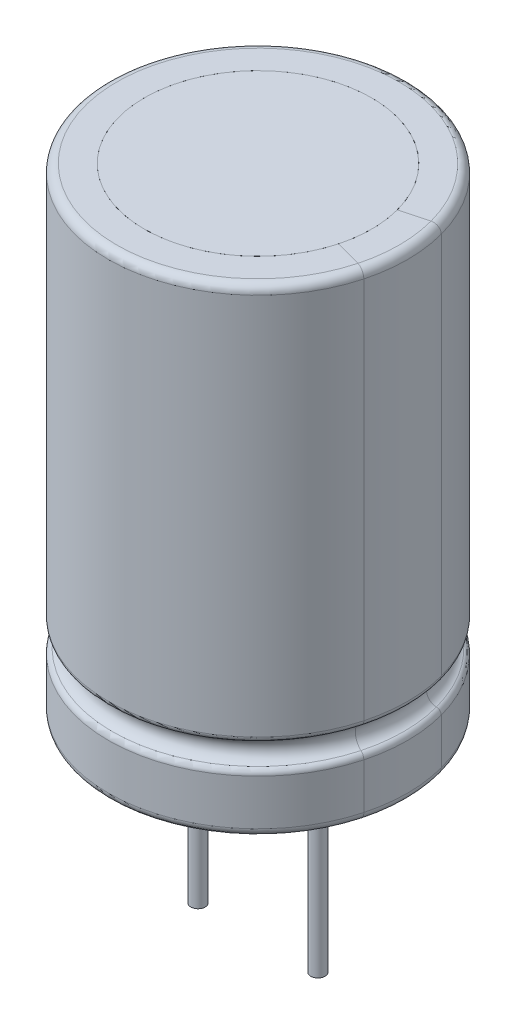
ISO-10303-21;
HEADER;
FILE_DESCRIPTION(('STEP AP214'),'2;1');
FILE_NAME('part.step','',(''),(''),'','','');
FILE_SCHEMA(('AUTOMOTIVE_DESIGN { 1 0 10303 214 1 1 1 1 }'));
ENDSEC;
DATA;
#1=APPLICATION_CONTEXT('core data for automotive mechanical design processes');
#2=APPLICATION_PROTOCOL_DEFINITION('international standard','automotive_design',2000,#1);
#3=PRODUCT_CONTEXT('',#1,'mechanical');
#4=PRODUCT('Part','Part','',(#3));
#5=PRODUCT_RELATED_PRODUCT_CATEGORY('part','',(#4));
#6=PRODUCT_DEFINITION_FORMATION('','',#4);
#7=PRODUCT_DEFINITION_CONTEXT('part definition',#1,'design');
#8=PRODUCT_DEFINITION('design','',#6,#7);
#9=PRODUCT_DEFINITION_SHAPE('','',#8);
#10=(LENGTH_UNIT() NAMED_UNIT(*) SI_UNIT(.MILLI.,.METRE.));
#11=(NAMED_UNIT(*) PLANE_ANGLE_UNIT() SI_UNIT($,.RADIAN.));
#12=(NAMED_UNIT(*) SI_UNIT($,.STERADIAN.) SOLID_ANGLE_UNIT());
#13=UNCERTAINTY_MEASURE_WITH_UNIT(LENGTH_MEASURE(1.E-05),#10,'distance_accuracy_value','');
#14=(GEOMETRIC_REPRESENTATION_CONTEXT(3) GLOBAL_UNCERTAINTY_ASSIGNED_CONTEXT((#13)) GLOBAL_UNIT_ASSIGNED_CONTEXT((#10,
#11,#12)) REPRESENTATION_CONTEXT('',''));
#15=CARTESIAN_POINT('',(0.,0.,0.));
#16=DIRECTION('',(0.,0.,1.));
#17=DIRECTION('',(1.,0.,0.));
#18=AXIS2_PLACEMENT_3D('',#15,#16,#17);
#19=CARTESIAN_POINT('',(2.50410434400621,-8.,0.));
#20=DIRECTION('',(0.,1.,0.));
#21=DIRECTION('',(0.,0.,1.));
#22=AXIS2_PLACEMENT_3D('',#19,#20,#21);
#23=CYLINDRICAL_SURFACE('',#22,0.3);
#24=CARTESIAN_POINT('',(2.50410434400621,-8.,0.));
#25=DIRECTION('',(0.,1.,0.));
#26=DIRECTION('',(0.,0.,1.));
#27=AXIS2_PLACEMENT_3D('',#24,#25,#26);
#28=CIRCLE('',#27,0.3);
#29=CARTESIAN_POINT('',(2.50410434400621,-8.,0.3));
#30=VERTEX_POINT('',#29);
#31=EDGE_CURVE('E11',#30,#30,#28,.T.);
#32=ORIENTED_EDGE('',*,*,#31,.T.);
#33=EDGE_LOOP('',(#32));
#34=FACE_BOUND('',#33,.T.);
#35=CARTESIAN_POINT('',(2.50410434400621,0.,0.));
#36=DIRECTION('',(0.,1.,0.));
#37=DIRECTION('',(0.,0.,1.));
#38=AXIS2_PLACEMENT_3D('',#35,#36,#37);
#39=CIRCLE('',#38,0.3);
#40=CARTESIAN_POINT('',(2.50410434400621,0.,0.3));
#41=VERTEX_POINT('',#40);
#42=EDGE_CURVE('E49',#41,#41,#39,.T.);
#43=ORIENTED_EDGE('',*,*,#42,.F.);
#44=EDGE_LOOP('',(#43));
#45=FACE_BOUND('',#44,.T.);
#46=ADVANCED_FACE('F46',(#34,#45),#23,.T.);
#47=CARTESIAN_POINT('',(2.50410434400621,-8.,0.));
#48=DIRECTION('',(0.,1.,0.));
#49=DIRECTION('',(0.,0.,1.));
#50=AXIS2_PLACEMENT_3D('',#47,#48,#49);
#51=PLANE('',#50);
#52=ORIENTED_EDGE('',*,*,#31,.F.);
#53=EDGE_LOOP('',(#52));
#54=FACE_BOUND('',#53,.T.);
#55=ADVANCED_FACE('F61',(#54),#51,.F.);
#56=CARTESIAN_POINT('',(2.50410434400621,0.,0.));
#57=DIRECTION('',(0.,1.,0.));
#58=DIRECTION('',(0.,0.,1.));
#59=AXIS2_PLACEMENT_3D('',#56,#57,#58);
#60=PLANE('',#59);
#61=ORIENTED_EDGE('',*,*,#42,.T.);
#62=EDGE_LOOP('',(#61));
#63=FACE_BOUND('',#62,.T.);
#64=ADVANCED_FACE('F58',(#63),#60,.T.);
#65=CLOSED_SHELL('',(#46,#55,#64));
#66=MANIFOLD_SOLID_BREP('B2',#65);
#67=CARTESIAN_POINT('',(-2.50410434400621,-8.,0.));
#68=DIRECTION('',(0.,1.,0.));
#69=DIRECTION('',(0.,0.,1.));
#70=AXIS2_PLACEMENT_3D('',#67,#68,#69);
#71=CYLINDRICAL_SURFACE('',#70,0.3);
#72=CARTESIAN_POINT('',(-2.50410434400621,-8.,0.));
#73=DIRECTION('',(0.,1.,0.));
#74=DIRECTION('',(0.,0.,1.));
#75=AXIS2_PLACEMENT_3D('',#72,#73,#74);
#76=CIRCLE('',#75,0.3);
#77=CARTESIAN_POINT('',(-2.50410434400621,-8.,0.3));
#78=VERTEX_POINT('',#77);
#79=EDGE_CURVE('E45',#78,#78,#76,.T.);
#80=ORIENTED_EDGE('',*,*,#79,.T.);
#81=EDGE_LOOP('',(#80));
#82=FACE_BOUND('',#81,.T.);
#83=CARTESIAN_POINT('',(-2.50410434400621,0.,0.));
#84=DIRECTION('',(0.,1.,0.));
#85=DIRECTION('',(0.,0.,1.));
#86=AXIS2_PLACEMENT_3D('',#83,#84,#85);
#87=CIRCLE('',#86,0.3);
#88=CARTESIAN_POINT('',(-2.50410434400621,0.,0.3));
#89=VERTEX_POINT('',#88);
#90=EDGE_CURVE('E100',#89,#89,#87,.T.);
#91=ORIENTED_EDGE('',*,*,#90,.F.);
#92=EDGE_LOOP('',(#91));
#93=FACE_BOUND('',#92,.T.);
#94=ADVANCED_FACE('F97',(#82,#93),#71,.T.);
#95=CARTESIAN_POINT('',(-2.50410434400621,-8.,0.));
#96=DIRECTION('',(0.,1.,0.));
#97=DIRECTION('',(0.,0.,1.));
#98=AXIS2_PLACEMENT_3D('',#95,#96,#97);
#99=PLANE('',#98);
#100=ORIENTED_EDGE('',*,*,#79,.F.);
#101=EDGE_LOOP('',(#100));
#102=FACE_BOUND('',#101,.T.);
#103=ADVANCED_FACE('F112',(#102),#99,.F.);
#104=CARTESIAN_POINT('',(-2.50410434400621,0.,0.));
#105=DIRECTION('',(0.,1.,0.));
#106=DIRECTION('',(0.,0.,1.));
#107=AXIS2_PLACEMENT_3D('',#104,#105,#106);
#108=PLANE('',#107);
#109=ORIENTED_EDGE('',*,*,#90,.T.);
#110=EDGE_LOOP('',(#109));
#111=FACE_BOUND('',#110,.T.);
#112=ADVANCED_FACE('F109',(#111),#108,.T.);
#113=CLOSED_SHELL('',(#94,#103,#112));
#114=MANIFOLD_SOLID_BREP('B6',#113);
#115=CARTESIAN_POINT('',(0.,20.,0.));
#116=DIRECTION('',(0.,-1.,0.));
#117=DIRECTION('',(0.,0.,-1.));
#118=AXIS2_PLACEMENT_3D('',#115,#116,#117);
#119=CYLINDRICAL_SURFACE('',#118,6.25);
#120=DIRECTION('',(0.,-1.,0.));
#121=VECTOR('',#120,1.);
#122=CARTESIAN_POINT('',(6.03703641430667,20.,-1.61761903189076));
#123=LINE('',#122,#121);
#124=CARTESIAN_POINT('',(6.03703641430667,2.25336517337282,-1.61761903189076));
#125=VERTEX_POINT('',#124);
#126=CARTESIAN_POINT('',(6.03703641430667,0.35,-1.61761903189076));
#127=VERTEX_POINT('',#126);
#128=EDGE_CURVE('E264',#125,#127,#123,.T.);
#129=ORIENTED_EDGE('',*,*,#128,.F.);
#130=CARTESIAN_POINT('',(0.,2.25336517337282,0.));
#131=DIRECTION('',(0.,-1.,0.));
#132=DIRECTION('',(0.,0.,-1.));
#133=AXIS2_PLACEMENT_3D('',#130,#131,#132);
#134=CIRCLE('',#133,6.25);
#135=CARTESIAN_POINT('',(6.03703641430668,2.25336517337282,1.61761903189076));
#136=VERTEX_POINT('',#135);
#137=EDGE_CURVE('E171',#125,#136,#134,.T.);
#138=ORIENTED_EDGE('',*,*,#137,.T.);
#139=DIRECTION('',(0.,-1.,0.));
#140=VECTOR('',#139,1.);
#141=CARTESIAN_POINT('',(6.03703641430668,20.,1.61761903189076));
#142=LINE('',#141,#140);
#143=CARTESIAN_POINT('',(6.03703641430668,0.35,1.61761903189076));
#144=VERTEX_POINT('',#143);
#145=EDGE_CURVE('E268',#136,#144,#142,.T.);
#146=ORIENTED_EDGE('',*,*,#145,.T.);
#147=CARTESIAN_POINT('',(0.,0.35,0.));
#148=DIRECTION('',(0.,1.,0.));
#149=DIRECTION('',(0.,0.,1.));
#150=AXIS2_PLACEMENT_3D('',#147,#148,#149);
#151=CIRCLE('',#150,6.25);
#152=EDGE_CURVE('E271',#144,#127,#151,.T.);
#153=ORIENTED_EDGE('',*,*,#152,.T.);
#154=EDGE_LOOP('',(#129,#138,#146,#153));
#155=FACE_BOUND('',#154,.T.);
#156=ADVANCED_FACE('F148',(#155),#119,.T.);
#157=CARTESIAN_POINT('',(6.03703641430668,19.65,1.61761903189076));
#158=VERTEX_POINT('',#157);
#159=CARTESIAN_POINT('',(6.03703641430668,3.66757873574592,1.61761903189076));
#160=VERTEX_POINT('',#159);
#161=EDGE_CURVE('E237',#158,#160,#142,.T.);
#162=ORIENTED_EDGE('',*,*,#161,.T.);
#163=CARTESIAN_POINT('',(0.,3.66757873574592,0.));
#164=DIRECTION('',(0.,1.,0.));
#165=DIRECTION('',(0.,0.,1.));
#166=AXIS2_PLACEMENT_3D('',#163,#164,#165);
#167=CIRCLE('',#166,6.25);
#168=CARTESIAN_POINT('',(6.03703641430667,3.66757873574592,-1.61761903189076));
#169=VERTEX_POINT('',#168);
#170=EDGE_CURVE('E95',#160,#169,#167,.T.);
#171=ORIENTED_EDGE('',*,*,#170,.T.);
#172=CARTESIAN_POINT('',(6.03703641430667,19.65,-1.61761903189076));
#173=VERTEX_POINT('',#172);
#174=EDGE_CURVE('E265',#173,#169,#123,.T.);
#175=ORIENTED_EDGE('',*,*,#174,.F.);
#176=CARTESIAN_POINT('',(0.,19.65,0.));
#177=DIRECTION('',(0.,1.,0.));
#178=DIRECTION('',(0.,0.,1.));
#179=AXIS2_PLACEMENT_3D('',#176,#177,#178);
#180=CIRCLE('',#179,6.25);
#181=EDGE_CURVE('E236',#173,#158,#180,.F.);
#182=ORIENTED_EDGE('',*,*,#181,.T.);
#183=EDGE_LOOP('',(#162,#171,#175,#182));
#184=FACE_BOUND('',#183,.T.);
#185=ADVANCED_FACE('F331',(#184),#119,.T.);
#186=CARTESIAN_POINT('',(0.,20.,0.));
#187=DIRECTION('',(0.,-1.,0.));
#188=DIRECTION('',(0.,0.,-1.));
#189=AXIS2_PLACEMENT_3D('',#186,#187,#188);
#190=CYLINDRICAL_SURFACE('',#189,4.75);
#191=CARTESIAN_POINT('',(0.,0.,0.));
#192=DIRECTION('',(0.,1.,0.));
#193=DIRECTION('',(0.,0.,1.));
#194=AXIS2_PLACEMENT_3D('',#191,#192,#193);
#195=CIRCLE('',#194,4.75);
#196=CARTESIAN_POINT('',(4.58814767487307,0.,1.22939046423698));
#197=VERTEX_POINT('',#196);
#198=CARTESIAN_POINT('',(4.58814767487307,0.,-1.22939046423698));
#199=VERTEX_POINT('',#198);
#200=EDGE_CURVE('E233',#197,#199,#195,.T.);
#201=ORIENTED_EDGE('',*,*,#200,.F.);
#202=DIRECTION('',(0.,-1.,0.));
#203=VECTOR('',#202,1.);
#204=CARTESIAN_POINT('',(4.58814767487307,20.,1.22939046423698));
#205=LINE('',#204,#203);
#206=CARTESIAN_POINT('',(4.58814767487307,20.,1.22939046423698));
#207=VERTEX_POINT('',#206);
#208=EDGE_CURVE('E226',#207,#197,#205,.T.);
#209=ORIENTED_EDGE('',*,*,#208,.F.);
#210=CARTESIAN_POINT('',(0.,20.,0.));
#211=DIRECTION('',(0.,1.,0.));
#212=DIRECTION('',(0.,0.,1.));
#213=AXIS2_PLACEMENT_3D('',#210,#211,#212);
#214=CIRCLE('',#213,4.75);
#215=CARTESIAN_POINT('',(4.58814767487307,20.,-1.22939046423698));
#216=VERTEX_POINT('',#215);
#217=EDGE_CURVE('E230',#207,#216,#214,.T.);
#218=ORIENTED_EDGE('',*,*,#217,.T.);
#219=DIRECTION('',(0.,-1.,0.));
#220=VECTOR('',#219,1.);
#221=CARTESIAN_POINT('',(4.58814767487307,20.,-1.22939046423698));
#222=LINE('',#221,#220);
#223=EDGE_CURVE('E260',#216,#199,#222,.T.);
#224=ORIENTED_EDGE('',*,*,#223,.T.);
#225=EDGE_LOOP('',(#201,#209,#218,#224));
#226=FACE_BOUND('',#225,.T.);
#227=ADVANCED_FACE('F228',(#226),#190,.F.);
#228=CARTESIAN_POINT('',(0.,20.,0.));
#229=DIRECTION('',(0.258819045102521,0.,-0.965925826289068));
#230=DIRECTION('',(-0.965925826289068,0.,-0.258819045102521));
#231=AXIS2_PLACEMENT_3D('',#228,#229,#230);
#232=PLANE('',#231);
#233=ORIENTED_EDGE('',*,*,#145,.F.);
#234=CARTESIAN_POINT('',(5.79555495773441,2.25336517337282,1.55291427061513));
#235=DIRECTION('',(0.258819045102521,0.,-0.965925826289068));
#236=DIRECTION('',(-0.965925826289068,0.,-0.258819045102521));
#237=AXIS2_PLACEMENT_3D('',#234,#235,#236);
#238=CIRCLE('',#237,0.25);
#239=CARTESIAN_POINT('',(5.87604877659183,2.48906743376834,1.57448252437367));
#240=VERTEX_POINT('',#239);
#241=EDGE_CURVE('E156',#136,#240,#238,.F.);
#242=ORIENTED_EDGE('',*,*,#241,.T.);
#243=CARTESIAN_POINT('',(6.03703641430668,2.96047195455937,1.61761903189076));
#244=DIRECTION('',(0.258819045102521,0.,-0.965925826289068));
#245=DIRECTION('',(-0.965925826289068,0.,-0.258819045102521));
#246=AXIS2_PLACEMENT_3D('',#243,#244,#245);
#247=CIRCLE('',#246,0.500000000000001);
#248=CARTESIAN_POINT('',(5.87604877659183,3.4318764753504,1.57448252437367));
#249=VERTEX_POINT('',#248);
#250=EDGE_CURVE('E257',#249,#240,#247,.F.);
#251=ORIENTED_EDGE('',*,*,#250,.F.);
#252=CARTESIAN_POINT('',(5.79555495773441,3.66757873574592,1.55291427061513));
#253=DIRECTION('',(0.258819045102521,0.,-0.965925826289068));
#254=DIRECTION('',(-0.965925826289068,0.,-0.258819045102521));
#255=AXIS2_PLACEMENT_3D('',#252,#253,#254);
#256=CIRCLE('',#255,0.25);
#257=EDGE_CURVE('E163',#249,#160,#256,.F.);
#258=ORIENTED_EDGE('',*,*,#257,.T.);
#259=ORIENTED_EDGE('',*,*,#161,.F.);
#260=CARTESIAN_POINT('',(5.6989623751055,19.65,1.52703236610488));
#261=DIRECTION('',(0.258819045102521,0.,-0.965925826289068));
#262=DIRECTION('',(-0.965925826289068,0.,-0.258819045102521));
#263=AXIS2_PLACEMENT_3D('',#260,#261,#262);
#264=CIRCLE('',#263,0.35);
#265=CARTESIAN_POINT('',(5.6989623751055,20.,1.52703236610488));
#266=VERTEX_POINT('',#265);
#267=EDGE_CURVE('E243',#158,#266,#264,.F.);
#268=ORIENTED_EDGE('',*,*,#267,.T.);
#269=DIRECTION('',(0.965925826289068,0.,0.258819045102521));
#270=VECTOR('',#269,1.);
#271=CARTESIAN_POINT('',(0.,20.,0.));
#272=LINE('',#271,#270);
#273=EDGE_CURVE('E240',#207,#266,#272,.T.);
#274=ORIENTED_EDGE('',*,*,#273,.F.);
#275=ORIENTED_EDGE('',*,*,#208,.T.);
#276=DIRECTION('',(0.965925826289068,0.,0.258819045102521));
#277=VECTOR('',#276,1.);
#278=CARTESIAN_POINT('',(0.,0.,0.));
#279=LINE('',#278,#277);
#280=CARTESIAN_POINT('',(5.6989623751055,0.,1.52703236610488));
#281=VERTEX_POINT('',#280);
#282=EDGE_CURVE('E254',#197,#281,#279,.T.);
#283=ORIENTED_EDGE('',*,*,#282,.T.);
#284=CARTESIAN_POINT('',(5.6989623751055,0.35,1.52703236610488));
#285=DIRECTION('',(0.258819045102521,0.,-0.965925826289068));
#286=DIRECTION('',(-0.965925826289068,0.,-0.258819045102521));
#287=AXIS2_PLACEMENT_3D('',#284,#285,#286);
#288=CIRCLE('',#287,0.35);
#289=EDGE_CURVE('E281',#281,#144,#288,.F.);
#290=ORIENTED_EDGE('',*,*,#289,.T.);
#291=EDGE_LOOP('',(#233,#242,#251,#258,#259,#268,#274,#275,#283,#290));
#292=FACE_BOUND('',#291,.T.);
#293=ADVANCED_FACE('F241',(#292),#232,.F.);
#294=CARTESIAN_POINT('',(0.,20.,0.));
#295=DIRECTION('',(-0.258819045102522,0.,-0.965925826289068));
#296=DIRECTION('',(-0.965925826289068,0.,0.258819045102522));
#297=AXIS2_PLACEMENT_3D('',#294,#295,#296);
#298=PLANE('',#297);
#299=CARTESIAN_POINT('',(6.03703641430668,2.96047195455937,-1.61761903189076));
#300=DIRECTION('',(-0.258819045102522,0.,-0.965925826289068));
#301=DIRECTION('',(-0.965925826289068,0.,0.258819045102522));
#302=AXIS2_PLACEMENT_3D('',#299,#300,#301);
#303=CIRCLE('',#302,0.500000000000001);
#304=CARTESIAN_POINT('',(5.87604877659183,3.4318764753504,-1.57448252437367));
#305=VERTEX_POINT('',#304);
#306=CARTESIAN_POINT('',(5.87604877659183,2.48906743376834,-1.57448252437367));
#307=VERTEX_POINT('',#306);
#308=EDGE_CURVE('E286',#305,#307,#303,.F.);
#309=ORIENTED_EDGE('',*,*,#308,.T.);
#310=CARTESIAN_POINT('',(5.79555495773441,2.25336517337282,-1.55291427061513));
#311=DIRECTION('',(-0.258819045102522,0.,-0.965925826289068));
#312=DIRECTION('',(-0.965925826289068,0.,0.258819045102522));
#313=AXIS2_PLACEMENT_3D('',#310,#311,#312);
#314=CIRCLE('',#313,0.25);
#315=EDGE_CURVE('E297',#307,#125,#314,.T.);
#316=ORIENTED_EDGE('',*,*,#315,.T.);
#317=ORIENTED_EDGE('',*,*,#128,.T.);
#318=CARTESIAN_POINT('',(5.6989623751055,0.35,-1.52703236610488));
#319=DIRECTION('',(-0.258819045102522,0.,-0.965925826289068));
#320=DIRECTION('',(-0.965925826289068,0.,0.258819045102522));
#321=AXIS2_PLACEMENT_3D('',#318,#319,#320);
#322=CIRCLE('',#321,0.35);
#323=CARTESIAN_POINT('',(5.6989623751055,0.,-1.52703236610488));
#324=VERTEX_POINT('',#323);
#325=EDGE_CURVE('E276',#127,#324,#322,.T.);
#326=ORIENTED_EDGE('',*,*,#325,.T.);
#327=DIRECTION('',(0.965925826289068,0.,-0.258819045102522));
#328=VECTOR('',#327,1.);
#329=CARTESIAN_POINT('',(0.,0.,0.));
#330=LINE('',#329,#328);
#331=EDGE_CURVE('E251',#199,#324,#330,.T.);
#332=ORIENTED_EDGE('',*,*,#331,.F.);
#333=ORIENTED_EDGE('',*,*,#223,.F.);
#334=DIRECTION('',(0.965925826289068,0.,-0.258819045102522));
#335=VECTOR('',#334,1.);
#336=CARTESIAN_POINT('',(0.,20.,0.));
#337=LINE('',#336,#335);
#338=CARTESIAN_POINT('',(5.6989623751055,20.,-1.52703236610488));
#339=VERTEX_POINT('',#338);
#340=EDGE_CURVE('E247',#216,#339,#337,.T.);
#341=ORIENTED_EDGE('',*,*,#340,.T.);
#342=CARTESIAN_POINT('',(5.6989623751055,19.65,-1.52703236610488));
#343=DIRECTION('',(-0.258819045102522,0.,-0.965925826289068));
#344=DIRECTION('',(-0.965925826289068,0.,0.258819045102522));
#345=AXIS2_PLACEMENT_3D('',#342,#343,#344);
#346=CIRCLE('',#345,0.35);
#347=EDGE_CURVE('E274',#339,#173,#346,.T.);
#348=ORIENTED_EDGE('',*,*,#347,.T.);
#349=ORIENTED_EDGE('',*,*,#174,.T.);
#350=CARTESIAN_POINT('',(5.79555495773441,3.66757873574592,-1.55291427061513));
#351=DIRECTION('',(-0.258819045102522,0.,-0.965925826289068));
#352=DIRECTION('',(-0.965925826289068,0.,0.258819045102522));
#353=AXIS2_PLACEMENT_3D('',#350,#351,#352);
#354=CIRCLE('',#353,0.25);
#355=EDGE_CURVE('E295',#169,#305,#354,.T.);
#356=ORIENTED_EDGE('',*,*,#355,.T.);
#357=EDGE_LOOP('',(#309,#316,#317,#326,#332,#333,#341,#348,#349,#356));
#358=FACE_BOUND('',#357,.T.);
#359=ADVANCED_FACE('F310',(#358),#298,.T.);
#360=CARTESIAN_POINT('',(0.,20.,0.));
#361=DIRECTION('',(0.,1.,0.));
#362=DIRECTION('',(0.,0.,1.));
#363=AXIS2_PLACEMENT_3D('',#360,#361,#362);
#364=PLANE('',#363);
#365=ORIENTED_EDGE('',*,*,#273,.T.);
#366=CARTESIAN_POINT('',(0.,20.,0.));
#367=DIRECTION('',(0.,1.,0.));
#368=DIRECTION('',(0.,0.,1.));
#369=AXIS2_PLACEMENT_3D('',#366,#367,#368);
#370=CIRCLE('',#369,5.9);
#371=EDGE_CURVE('E284',#266,#339,#370,.T.);
#372=ORIENTED_EDGE('',*,*,#371,.T.);
#373=ORIENTED_EDGE('',*,*,#340,.F.);
#374=ORIENTED_EDGE('',*,*,#217,.F.);
#375=EDGE_LOOP('',(#365,#372,#373,#374));
#376=FACE_BOUND('',#375,.T.);
#377=ADVANCED_FACE('F249',(#376),#364,.T.);
#378=CARTESIAN_POINT('',(0.,0.,0.));
#379=DIRECTION('',(0.,1.,0.));
#380=DIRECTION('',(0.,0.,1.));
#381=AXIS2_PLACEMENT_3D('',#378,#379,#380);
#382=PLANE('',#381);
#383=ORIENTED_EDGE('',*,*,#331,.T.);
#384=CARTESIAN_POINT('',(0.,0.,0.));
#385=DIRECTION('',(0.,1.,0.));
#386=DIRECTION('',(0.,0.,1.));
#387=AXIS2_PLACEMENT_3D('',#384,#385,#386);
#388=CIRCLE('',#387,5.9);
#389=EDGE_CURVE('E278',#324,#281,#388,.F.);
#390=ORIENTED_EDGE('',*,*,#389,.T.);
#391=ORIENTED_EDGE('',*,*,#282,.F.);
#392=ORIENTED_EDGE('',*,*,#200,.T.);
#393=EDGE_LOOP('',(#383,#390,#391,#392));
#394=FACE_BOUND('',#393,.T.);
#395=ADVANCED_FACE('F319',(#394),#382,.F.);
#396=CARTESIAN_POINT('',(0.,0.35,0.));
#397=DIRECTION('',(0.,1.,0.));
#398=DIRECTION('',(0.,0.,1.));
#399=AXIS2_PLACEMENT_3D('',#396,#397,#398);
#400=TOROIDAL_SURFACE('',#399,5.9,0.35);
#401=ORIENTED_EDGE('',*,*,#289,.F.);
#402=ORIENTED_EDGE('',*,*,#389,.F.);
#403=ORIENTED_EDGE('',*,*,#325,.F.);
#404=ORIENTED_EDGE('',*,*,#152,.F.);
#405=EDGE_LOOP('',(#401,#402,#403,#404));
#406=FACE_BOUND('',#405,.T.);
#407=ADVANCED_FACE('F315',(#406),#400,.T.);
#408=CARTESIAN_POINT('',(0.,19.65,0.));
#409=DIRECTION('',(0.,1.,0.));
#410=DIRECTION('',(0.,0.,1.));
#411=AXIS2_PLACEMENT_3D('',#408,#409,#410);
#412=TOROIDAL_SURFACE('',#411,5.9,0.35);
#413=ORIENTED_EDGE('',*,*,#267,.F.);
#414=ORIENTED_EDGE('',*,*,#181,.F.);
#415=ORIENTED_EDGE('',*,*,#347,.F.);
#416=ORIENTED_EDGE('',*,*,#371,.F.);
#417=EDGE_LOOP('',(#413,#414,#415,#416));
#418=FACE_BOUND('',#417,.T.);
#419=ADVANCED_FACE('F326',(#418),#412,.T.);
#420=CARTESIAN_POINT('',(0.,2.96047195455937,0.));
#421=DIRECTION('',(0.,-1.,0.));
#422=DIRECTION('',(0.,0.,-1.));
#423=AXIS2_PLACEMENT_3D('',#420,#421,#422);
#424=TOROIDAL_SURFACE('',#423,6.25,0.500000000000001);
#425=ORIENTED_EDGE('',*,*,#250,.T.);
#426=CARTESIAN_POINT('',(0.,2.48906743376847,0.));
#427=DIRECTION('',(0.,1.,0.));
#428=DIRECTION('',(0.,0.,1.));
#429=AXIS2_PLACEMENT_3D('',#426,#427,#428);
#430=CIRCLE('',#429,6.08333333333338);
#431=EDGE_CURVE('E292',#240,#307,#430,.T.);
#432=ORIENTED_EDGE('',*,*,#431,.T.);
#433=ORIENTED_EDGE('',*,*,#308,.F.);
#434=CARTESIAN_POINT('',(0.,3.43187647535033,0.));
#435=DIRECTION('',(0.,-1.,0.));
#436=DIRECTION('',(0.,0.,-1.));
#437=AXIS2_PLACEMENT_3D('',#434,#435,#436);
#438=CIRCLE('',#437,6.08333333333336);
#439=EDGE_CURVE('E289',#305,#249,#438,.T.);
#440=ORIENTED_EDGE('',*,*,#439,.T.);
#441=EDGE_LOOP('',(#425,#432,#433,#440));
#442=FACE_BOUND('',#441,.T.);
#443=ADVANCED_FACE('F305',(#442),#424,.F.);
#444=CARTESIAN_POINT('',(0.,2.25336517337282,0.));
#445=DIRECTION('',(0.,-1.,0.));
#446=DIRECTION('',(0.,0.,-1.));
#447=AXIS2_PLACEMENT_3D('',#444,#445,#446);
#448=TOROIDAL_SURFACE('',#447,6.,0.25);
#449=ORIENTED_EDGE('',*,*,#241,.F.);
#450=ORIENTED_EDGE('',*,*,#137,.F.);
#451=ORIENTED_EDGE('',*,*,#315,.F.);
#452=ORIENTED_EDGE('',*,*,#431,.F.);
#453=EDGE_LOOP('',(#449,#450,#451,#452));
#454=FACE_BOUND('',#453,.T.);
#455=ADVANCED_FACE('F308',(#454),#448,.T.);
#456=CARTESIAN_POINT('',(0.,3.66757873574592,0.));
#457=DIRECTION('',(0.,1.,0.));
#458=DIRECTION('',(0.,0.,1.));
#459=AXIS2_PLACEMENT_3D('',#456,#457,#458);
#460=TOROIDAL_SURFACE('',#459,6.,0.25);
#461=ORIENTED_EDGE('',*,*,#355,.F.);
#462=ORIENTED_EDGE('',*,*,#170,.F.);
#463=ORIENTED_EDGE('',*,*,#257,.F.);
#464=ORIENTED_EDGE('',*,*,#439,.F.);
#465=EDGE_LOOP('',(#461,#462,#463,#464));
#466=FACE_BOUND('',#465,.T.);
#467=ADVANCED_FACE('F150',(#466),#460,.T.);
#468=CLOSED_SHELL('',(#156,#185,#227,#293,#359,#377,#395,#407,#419,#443,#455,#467));
#469=MANIFOLD_SOLID_BREP('B40',#468);
#470=CARTESIAN_POINT('',(0.,20.,0.));
#471=DIRECTION('',(0.,-1.,0.));
#472=DIRECTION('',(0.,0.,-1.));
#473=AXIS2_PLACEMENT_3D('',#470,#471,#472);
#474=CYLINDRICAL_SURFACE('',#473,6.25);
#475=DIRECTION('',(0.,-1.,0.));
#476=VECTOR('',#475,1.);
#477=CARTESIAN_POINT('',(6.03703641430668,20.,1.61761903189076));
#478=LINE('',#477,#476);
#479=CARTESIAN_POINT('',(6.03703641430668,2.25336517337282,1.61761903189076));
#480=VERTEX_POINT('',#479);
#481=CARTESIAN_POINT('',(6.03703641430668,0.35,1.61761903189076));
#482=VERTEX_POINT('',#481);
#483=EDGE_CURVE('E548',#480,#482,#478,.T.);
#484=ORIENTED_EDGE('',*,*,#483,.F.);
#485=CARTESIAN_POINT('',(0.,2.25336517337282,0.));
#486=DIRECTION('',(0.,-1.,0.));
#487=DIRECTION('',(0.,0.,-1.));
#488=AXIS2_PLACEMENT_3D('',#485,#486,#487);
#489=CIRCLE('',#488,6.25);
#490=CARTESIAN_POINT('',(6.03703641430667,2.25336517337282,-1.61761903189076));
#491=VERTEX_POINT('',#490);
#492=EDGE_CURVE('E455',#480,#491,#489,.T.);
#493=ORIENTED_EDGE('',*,*,#492,.T.);
#494=DIRECTION('',(0.,-1.,0.));
#495=VECTOR('',#494,1.);
#496=CARTESIAN_POINT('',(6.03703641430667,20.,-1.61761903189076));
#497=LINE('',#496,#495);
#498=CARTESIAN_POINT('',(6.03703641430667,0.35,-1.61761903189076));
#499=VERTEX_POINT('',#498);
#500=EDGE_CURVE('E552',#491,#499,#497,.T.);
#501=ORIENTED_EDGE('',*,*,#500,.T.);
#502=CARTESIAN_POINT('',(0.,0.35,0.));
#503=DIRECTION('',(0.,1.,0.));
#504=DIRECTION('',(0.,0.,1.));
#505=AXIS2_PLACEMENT_3D('',#502,#503,#504);
#506=CIRCLE('',#505,6.25);
#507=EDGE_CURVE('E560',#499,#482,#506,.T.);
#508=ORIENTED_EDGE('',*,*,#507,.T.);
#509=EDGE_LOOP('',(#484,#493,#501,#508));
#510=FACE_BOUND('',#509,.T.);
#511=ADVANCED_FACE('F432',(#510),#474,.T.);
#512=CARTESIAN_POINT('',(6.03703641430667,19.65,-1.61761903189076));
#513=VERTEX_POINT('',#512);
#514=CARTESIAN_POINT('',(6.03703641430667,3.66757873574592,-1.61761903189076));
#515=VERTEX_POINT('',#514);
#516=EDGE_CURVE('E521',#513,#515,#497,.T.);
#517=ORIENTED_EDGE('',*,*,#516,.T.);
#518=CARTESIAN_POINT('',(0.,3.66757873574592,0.));
#519=DIRECTION('',(0.,1.,0.));
#520=DIRECTION('',(0.,0.,1.));
#521=AXIS2_PLACEMENT_3D('',#518,#519,#520);
#522=CIRCLE('',#521,6.25);
#523=CARTESIAN_POINT('',(6.03703641430668,3.66757873574592,1.61761903189076));
#524=VERTEX_POINT('',#523);
#525=EDGE_CURVE('E146',#515,#524,#522,.T.);
#526=ORIENTED_EDGE('',*,*,#525,.T.);
#527=CARTESIAN_POINT('',(6.03703641430668,19.65,1.61761903189076));
#528=VERTEX_POINT('',#527);
#529=EDGE_CURVE('E549',#528,#524,#478,.T.);
#530=ORIENTED_EDGE('',*,*,#529,.F.);
#531=CARTESIAN_POINT('',(0.,19.65,0.));
#532=DIRECTION('',(0.,1.,0.));
#533=DIRECTION('',(0.,0.,1.));
#534=AXIS2_PLACEMENT_3D('',#531,#532,#533);
#535=CIRCLE('',#534,6.25);
#536=EDGE_CURVE('E557',#528,#513,#535,.F.);
#537=ORIENTED_EDGE('',*,*,#536,.T.);
#538=EDGE_LOOP('',(#517,#526,#530,#537));
#539=FACE_BOUND('',#538,.T.);
#540=ADVANCED_FACE('F616',(#539),#474,.T.);
#541=CARTESIAN_POINT('',(0.,20.,0.));
#542=DIRECTION('',(0.,-1.,0.));
#543=DIRECTION('',(0.,0.,-1.));
#544=AXIS2_PLACEMENT_3D('',#541,#542,#543);
#545=CYLINDRICAL_SURFACE('',#544,4.75);
#546=CARTESIAN_POINT('',(0.,0.,0.));
#547=DIRECTION('',(0.,1.,0.));
#548=DIRECTION('',(0.,0.,1.));
#549=AXIS2_PLACEMENT_3D('',#546,#547,#548);
#550=CIRCLE('',#549,4.75);
#551=CARTESIAN_POINT('',(4.58814767487307,0.,-1.22939046423698));
#552=VERTEX_POINT('',#551);
#553=CARTESIAN_POINT('',(4.58814767487307,0.,1.22939046423698));
#554=VERTEX_POINT('',#553);
#555=EDGE_CURVE('E517',#552,#554,#550,.T.);
#556=ORIENTED_EDGE('',*,*,#555,.F.);
#557=DIRECTION('',(0.,-1.,0.));
#558=VECTOR('',#557,1.);
#559=CARTESIAN_POINT('',(4.58814767487307,20.,-1.22939046423698));
#560=LINE('',#559,#558);
#561=CARTESIAN_POINT('',(4.58814767487307,20.,-1.22939046423698));
#562=VERTEX_POINT('',#561);
#563=EDGE_CURVE('E510',#562,#552,#560,.T.);
#564=ORIENTED_EDGE('',*,*,#563,.F.);
#565=CARTESIAN_POINT('',(0.,20.,0.));
#566=DIRECTION('',(0.,1.,0.));
#567=DIRECTION('',(0.,0.,1.));
#568=AXIS2_PLACEMENT_3D('',#565,#566,#567);
#569=CIRCLE('',#568,4.75);
#570=CARTESIAN_POINT('',(4.58814767487307,20.,1.22939046423698));
#571=VERTEX_POINT('',#570);
#572=EDGE_CURVE('E514',#562,#571,#569,.T.);
#573=ORIENTED_EDGE('',*,*,#572,.T.);
#574=DIRECTION('',(0.,-1.,0.));
#575=VECTOR('',#574,1.);
#576=CARTESIAN_POINT('',(4.58814767487307,20.,1.22939046423698));
#577=LINE('',#576,#575);
#578=EDGE_CURVE('E544',#571,#554,#577,.T.);
#579=ORIENTED_EDGE('',*,*,#578,.T.);
#580=EDGE_LOOP('',(#556,#564,#573,#579));
#581=FACE_BOUND('',#580,.T.);
#582=ADVANCED_FACE('F512',(#581),#545,.F.);
#583=CARTESIAN_POINT('',(0.,20.,0.));
#584=DIRECTION('',(-0.258819045102522,0.,-0.965925826289068));
#585=DIRECTION('',(-0.965925826289068,0.,0.258819045102522));
#586=AXIS2_PLACEMENT_3D('',#583,#584,#585);
#587=PLANE('',#586);
#588=ORIENTED_EDGE('',*,*,#500,.F.);
#589=CARTESIAN_POINT('',(5.79555495773441,2.25336517337282,-1.55291427061513));
#590=DIRECTION('',(-0.258819045102522,0.,-0.965925826289068));
#591=DIRECTION('',(-0.965925826289068,0.,0.258819045102522));
#592=AXIS2_PLACEMENT_3D('',#589,#590,#591);
#593=CIRCLE('',#592,0.25);
#594=CARTESIAN_POINT('',(5.87604877659183,2.48906743376834,-1.57448252437367));
#595=VERTEX_POINT('',#594);
#596=EDGE_CURVE('E440',#491,#595,#593,.F.);
#597=ORIENTED_EDGE('',*,*,#596,.T.);
#598=CARTESIAN_POINT('',(6.03703641430668,2.96047195455937,-1.61761903189076));
#599=DIRECTION('',(-0.258819045102522,0.,-0.965925826289068));
#600=DIRECTION('',(-0.965925826289068,0.,0.258819045102522));
#601=AXIS2_PLACEMENT_3D('',#598,#599,#600);
#602=CIRCLE('',#601,0.500000000000001);
#603=CARTESIAN_POINT('',(5.87604877659183,3.4318764753504,-1.57448252437367));
#604=VERTEX_POINT('',#603);
#605=EDGE_CURVE('E541',#604,#595,#602,.F.);
#606=ORIENTED_EDGE('',*,*,#605,.F.);
#607=CARTESIAN_POINT('',(5.79555495773441,3.66757873574592,-1.55291427061513));
#608=DIRECTION('',(-0.258819045102522,0.,-0.965925826289068));
#609=DIRECTION('',(-0.965925826289068,0.,0.258819045102522));
#610=AXIS2_PLACEMENT_3D('',#607,#608,#609);
#611=CIRCLE('',#610,0.25);
#612=EDGE_CURVE('E447',#604,#515,#611,.F.);
#613=ORIENTED_EDGE('',*,*,#612,.T.);
#614=ORIENTED_EDGE('',*,*,#516,.F.);
#615=CARTESIAN_POINT('',(5.6989623751055,19.65,-1.52703236610488));
#616=DIRECTION('',(-0.258819045102522,0.,-0.965925826289068));
#617=DIRECTION('',(-0.965925826289068,0.,0.258819045102522));
#618=AXIS2_PLACEMENT_3D('',#615,#616,#617);
#619=CIRCLE('',#618,0.35);
#620=CARTESIAN_POINT('',(5.6989623751055,20.,-1.52703236610488));
#621=VERTEX_POINT('',#620);
#622=EDGE_CURVE('E527',#513,#621,#619,.F.);
#623=ORIENTED_EDGE('',*,*,#622,.T.);
#624=DIRECTION('',(0.965925826289068,0.,-0.258819045102522));
#625=VECTOR('',#624,1.);
#626=CARTESIAN_POINT('',(0.,20.,0.));
#627=LINE('',#626,#625);
#628=EDGE_CURVE('E524',#562,#621,#627,.T.);
#629=ORIENTED_EDGE('',*,*,#628,.F.);
#630=ORIENTED_EDGE('',*,*,#563,.T.);
#631=DIRECTION('',(0.965925826289068,0.,-0.258819045102522));
#632=VECTOR('',#631,1.);
#633=CARTESIAN_POINT('',(0.,0.,0.));
#634=LINE('',#633,#632);
#635=CARTESIAN_POINT('',(5.6989623751055,0.,-1.52703236610488));
#636=VERTEX_POINT('',#635);
#637=EDGE_CURVE('E538',#552,#636,#634,.T.);
#638=ORIENTED_EDGE('',*,*,#637,.T.);
#639=CARTESIAN_POINT('',(5.6989623751055,0.35,-1.52703236610488));
#640=DIRECTION('',(-0.258819045102522,0.,-0.965925826289068));
#641=DIRECTION('',(-0.965925826289068,0.,0.258819045102522));
#642=AXIS2_PLACEMENT_3D('',#639,#640,#641);
#643=CIRCLE('',#642,0.35);
#644=EDGE_CURVE('E567',#636,#499,#643,.F.);
#645=ORIENTED_EDGE('',*,*,#644,.T.);
#646=EDGE_LOOP('',(#588,#597,#606,#613,#614,#623,#629,#630,#638,#645));
#647=FACE_BOUND('',#646,.T.);
#648=ADVANCED_FACE('F525',(#647),#587,.F.);
#649=CARTESIAN_POINT('',(0.,20.,0.));
#650=DIRECTION('',(0.258819045102521,0.,-0.965925826289068));
#651=DIRECTION('',(-0.965925826289068,0.,-0.258819045102521));
#652=AXIS2_PLACEMENT_3D('',#649,#650,#651);
#653=PLANE('',#652);
#654=CARTESIAN_POINT('',(6.03703641430668,2.96047195455937,1.61761903189076));
#655=DIRECTION('',(0.258819045102521,0.,-0.965925826289068));
#656=DIRECTION('',(-0.965925826289068,0.,-0.258819045102521));
#657=AXIS2_PLACEMENT_3D('',#654,#655,#656);
#658=CIRCLE('',#657,0.500000000000001);
#659=CARTESIAN_POINT('',(5.87604877659183,3.4318764753504,1.57448252437367));
#660=VERTEX_POINT('',#659);
#661=CARTESIAN_POINT('',(5.87604877659183,2.48906743376834,1.57448252437367));
#662=VERTEX_POINT('',#661);
#663=EDGE_CURVE('E570',#660,#662,#658,.F.);
#664=ORIENTED_EDGE('',*,*,#663,.T.);
#665=CARTESIAN_POINT('',(5.79555495773441,2.25336517337282,1.55291427061513));
#666=DIRECTION('',(0.258819045102521,0.,-0.965925826289068));
#667=DIRECTION('',(-0.965925826289068,0.,-0.258819045102521));
#668=AXIS2_PLACEMENT_3D('',#665,#666,#667);
#669=CIRCLE('',#668,0.25);
#670=EDGE_CURVE('E581',#662,#480,#669,.T.);
#671=ORIENTED_EDGE('',*,*,#670,.T.);
#672=ORIENTED_EDGE('',*,*,#483,.T.);
#673=CARTESIAN_POINT('',(5.6989623751055,0.35,1.52703236610488));
#674=DIRECTION('',(0.258819045102521,0.,-0.965925826289068));
#675=DIRECTION('',(-0.965925826289068,0.,-0.258819045102521));
#676=AXIS2_PLACEMENT_3D('',#673,#674,#675);
#677=CIRCLE('',#676,0.35);
#678=CARTESIAN_POINT('',(5.6989623751055,0.,1.52703236610488));
#679=VERTEX_POINT('',#678);
#680=EDGE_CURVE('E563',#482,#679,#677,.T.);
#681=ORIENTED_EDGE('',*,*,#680,.T.);
#682=DIRECTION('',(0.965925826289068,0.,0.258819045102521));
#683=VECTOR('',#682,1.);
#684=CARTESIAN_POINT('',(0.,0.,0.));
#685=LINE('',#684,#683);
#686=EDGE_CURVE('E535',#554,#679,#685,.T.);
#687=ORIENTED_EDGE('',*,*,#686,.F.);
#688=ORIENTED_EDGE('',*,*,#578,.F.);
#689=DIRECTION('',(0.965925826289068,0.,0.258819045102521));
#690=VECTOR('',#689,1.);
#691=CARTESIAN_POINT('',(0.,20.,0.));
#692=LINE('',#691,#690);
#693=CARTESIAN_POINT('',(5.6989623751055,20.,1.52703236610488));
#694=VERTEX_POINT('',#693);
#695=EDGE_CURVE('E531',#571,#694,#692,.T.);
#696=ORIENTED_EDGE('',*,*,#695,.T.);
#697=CARTESIAN_POINT('',(5.6989623751055,19.65,1.52703236610488));
#698=DIRECTION('',(0.258819045102521,0.,-0.965925826289068));
#699=DIRECTION('',(-0.965925826289068,0.,-0.258819045102521));
#700=AXIS2_PLACEMENT_3D('',#697,#698,#699);
#701=CIRCLE('',#700,0.35);
#702=EDGE_CURVE('E555',#694,#528,#701,.T.);
#703=ORIENTED_EDGE('',*,*,#702,.T.);
#704=ORIENTED_EDGE('',*,*,#529,.T.);
#705=CARTESIAN_POINT('',(5.79555495773441,3.66757873574592,1.55291427061513));
#706=DIRECTION('',(0.258819045102521,0.,-0.965925826289068));
#707=DIRECTION('',(-0.965925826289068,0.,-0.258819045102521));
#708=AXIS2_PLACEMENT_3D('',#705,#706,#707);
#709=CIRCLE('',#708,0.25);
#710=EDGE_CURVE('E579',#524,#660,#709,.T.);
#711=ORIENTED_EDGE('',*,*,#710,.T.);
#712=EDGE_LOOP('',(#664,#671,#672,#681,#687,#688,#696,#703,#704,#711));
#713=FACE_BOUND('',#712,.T.);
#714=ADVANCED_FACE('F594',(#713),#653,.T.);
#715=CARTESIAN_POINT('',(0.,20.,0.));
#716=DIRECTION('',(0.,1.,0.));
#717=DIRECTION('',(0.,0.,1.));
#718=AXIS2_PLACEMENT_3D('',#715,#716,#717);
#719=PLANE('',#718);
#720=ORIENTED_EDGE('',*,*,#628,.T.);
#721=CARTESIAN_POINT('',(0.,20.,0.));
#722=DIRECTION('',(0.,1.,0.));
#723=DIRECTION('',(0.,0.,1.));
#724=AXIS2_PLACEMENT_3D('',#721,#722,#723);
#725=CIRCLE('',#724,5.9);
#726=EDGE_CURVE('E520',#621,#694,#725,.T.);
#727=ORIENTED_EDGE('',*,*,#726,.T.);
#728=ORIENTED_EDGE('',*,*,#695,.F.);
#729=ORIENTED_EDGE('',*,*,#572,.F.);
#730=EDGE_LOOP('',(#720,#727,#728,#729));
#731=FACE_BOUND('',#730,.T.);
#732=ADVANCED_FACE('F533',(#731),#719,.T.);
#733=CARTESIAN_POINT('',(0.,0.,0.));
#734=DIRECTION('',(0.,1.,0.));
#735=DIRECTION('',(0.,0.,1.));
#736=AXIS2_PLACEMENT_3D('',#733,#734,#735);
#737=PLANE('',#736);
#738=ORIENTED_EDGE('',*,*,#686,.T.);
#739=CARTESIAN_POINT('',(0.,0.,0.));
#740=DIRECTION('',(0.,1.,0.));
#741=DIRECTION('',(0.,0.,1.));
#742=AXIS2_PLACEMENT_3D('',#739,#740,#741);
#743=CIRCLE('',#742,5.9);
#744=EDGE_CURVE('E565',#679,#636,#743,.F.);
#745=ORIENTED_EDGE('',*,*,#744,.T.);
#746=ORIENTED_EDGE('',*,*,#637,.F.);
#747=ORIENTED_EDGE('',*,*,#555,.T.);
#748=EDGE_LOOP('',(#738,#745,#746,#747));
#749=FACE_BOUND('',#748,.T.);
#750=ADVANCED_FACE('F603',(#749),#737,.F.);
#751=CARTESIAN_POINT('',(0.,19.65,0.));
#752=DIRECTION('',(0.,1.,0.));
#753=DIRECTION('',(0.,0.,1.));
#754=AXIS2_PLACEMENT_3D('',#751,#752,#753);
#755=TOROIDAL_SURFACE('',#754,5.9,0.35);
#756=ORIENTED_EDGE('',*,*,#622,.F.);
#757=ORIENTED_EDGE('',*,*,#536,.F.);
#758=ORIENTED_EDGE('',*,*,#702,.F.);
#759=ORIENTED_EDGE('',*,*,#726,.F.);
#760=EDGE_LOOP('',(#756,#757,#758,#759));
#761=FACE_BOUND('',#760,.T.);
#762=ADVANCED_FACE('F605',(#761),#755,.T.);
#763=CARTESIAN_POINT('',(0.,0.35,0.));
#764=DIRECTION('',(0.,1.,0.));
#765=DIRECTION('',(0.,0.,1.));
#766=AXIS2_PLACEMENT_3D('',#763,#764,#765);
#767=TOROIDAL_SURFACE('',#766,5.9,0.35);
#768=ORIENTED_EDGE('',*,*,#644,.F.);
#769=ORIENTED_EDGE('',*,*,#744,.F.);
#770=ORIENTED_EDGE('',*,*,#680,.F.);
#771=ORIENTED_EDGE('',*,*,#507,.F.);
#772=EDGE_LOOP('',(#768,#769,#770,#771));
#773=FACE_BOUND('',#772,.T.);
#774=ADVANCED_FACE('F599',(#773),#767,.T.);
#775=CARTESIAN_POINT('',(0.,2.96047195455937,0.));
#776=DIRECTION('',(0.,-1.,0.));
#777=DIRECTION('',(0.,0.,-1.));
#778=AXIS2_PLACEMENT_3D('',#775,#776,#777);
#779=TOROIDAL_SURFACE('',#778,6.25,0.500000000000001);
#780=ORIENTED_EDGE('',*,*,#605,.T.);
#781=CARTESIAN_POINT('',(0.,2.48906743376841,0.));
#782=DIRECTION('',(0.,1.,0.));
#783=DIRECTION('',(0.,0.,1.));
#784=AXIS2_PLACEMENT_3D('',#781,#782,#783);
#785=CIRCLE('',#784,6.08333333333336);
#786=EDGE_CURVE('E576',#595,#662,#785,.T.);
#787=ORIENTED_EDGE('',*,*,#786,.T.);
#788=ORIENTED_EDGE('',*,*,#663,.F.);
#789=CARTESIAN_POINT('',(0.,3.43187647535033,0.));
#790=DIRECTION('',(0.,-1.,0.));
#791=DIRECTION('',(0.,0.,-1.));
#792=AXIS2_PLACEMENT_3D('',#789,#790,#791);
#793=CIRCLE('',#792,6.08333333333336);
#794=EDGE_CURVE('E573',#660,#604,#793,.T.);
#795=ORIENTED_EDGE('',*,*,#794,.T.);
#796=EDGE_LOOP('',(#780,#787,#788,#795));
#797=FACE_BOUND('',#796,.T.);
#798=ADVANCED_FACE('F589',(#797),#779,.F.);
#799=CARTESIAN_POINT('',(0.,2.25336517337282,0.));
#800=DIRECTION('',(0.,-1.,0.));
#801=DIRECTION('',(0.,0.,-1.));
#802=AXIS2_PLACEMENT_3D('',#799,#800,#801);
#803=TOROIDAL_SURFACE('',#802,6.,0.25);
#804=ORIENTED_EDGE('',*,*,#596,.F.);
#805=ORIENTED_EDGE('',*,*,#492,.F.);
#806=ORIENTED_EDGE('',*,*,#670,.F.);
#807=ORIENTED_EDGE('',*,*,#786,.F.);
#808=EDGE_LOOP('',(#804,#805,#806,#807));
#809=FACE_BOUND('',#808,.T.);
#810=ADVANCED_FACE('F592',(#809),#803,.T.);
#811=CARTESIAN_POINT('',(0.,3.66757873574592,0.));
#812=DIRECTION('',(0.,1.,0.));
#813=DIRECTION('',(0.,0.,1.));
#814=AXIS2_PLACEMENT_3D('',#811,#812,#813);
#815=TOROIDAL_SURFACE('',#814,6.,0.25);
#816=ORIENTED_EDGE('',*,*,#710,.F.);
#817=ORIENTED_EDGE('',*,*,#525,.F.);
#818=ORIENTED_EDGE('',*,*,#612,.F.);
#819=ORIENTED_EDGE('',*,*,#794,.F.);
#820=EDGE_LOOP('',(#816,#817,#818,#819));
#821=FACE_BOUND('',#820,.T.);
#822=ADVANCED_FACE('F434',(#821),#815,.T.);
#823=CLOSED_SHELL('',(#511,#540,#582,#648,#714,#732,#750,#762,#774,#798,#810,#822));
#824=MANIFOLD_SOLID_BREP('B89',#823);
#825=CARTESIAN_POINT('',(0.,20.,0.));
#826=DIRECTION('',(0.,-1.,0.));
#827=DIRECTION('',(0.,0.,-1.));
#828=AXIS2_PLACEMENT_3D('',#825,#826,#827);
#829=CYLINDRICAL_SURFACE('',#828,4.75);
#830=CARTESIAN_POINT('',(0.,20.,0.));
#831=DIRECTION('',(0.,1.,0.));
#832=DIRECTION('',(0.,0.,1.));
#833=AXIS2_PLACEMENT_3D('',#830,#831,#832);
#834=CIRCLE('',#833,4.75);
#835=CARTESIAN_POINT('',(0.,20.,4.75));
#836=VERTEX_POINT('',#835);
#837=EDGE_CURVE('E431',#836,#836,#834,.T.);
#838=ORIENTED_EDGE('',*,*,#837,.F.);
#839=EDGE_LOOP('',(#838));
#840=FACE_BOUND('',#839,.T.);
#841=CARTESIAN_POINT('',(0.,0.,0.));
#842=DIRECTION('',(0.,1.,0.));
#843=DIRECTION('',(0.,0.,1.));
#844=AXIS2_PLACEMENT_3D('',#841,#842,#843);
#845=CIRCLE('',#844,4.75);
#846=CARTESIAN_POINT('',(0.,0.,4.75));
#847=VERTEX_POINT('',#846);
#848=EDGE_CURVE('E712',#847,#847,#845,.T.);
#849=ORIENTED_EDGE('',*,*,#848,.T.);
#850=EDGE_LOOP('',(#849));
#851=FACE_BOUND('',#850,.T.);
#852=ADVANCED_FACE('F709',(#840,#851),#829,.T.);
#853=CARTESIAN_POINT('',(0.,20.,0.));
#854=DIRECTION('',(0.,1.,0.));
#855=DIRECTION('',(0.,0.,1.));
#856=AXIS2_PLACEMENT_3D('',#853,#854,#855);
#857=PLANE('',#856);
#858=ORIENTED_EDGE('',*,*,#837,.T.);
#859=EDGE_LOOP('',(#858));
#860=FACE_BOUND('',#859,.T.);
#861=ADVANCED_FACE('F724',(#860),#857,.T.);
#862=CARTESIAN_POINT('',(0.,0.,0.));
#863=DIRECTION('',(0.,1.,0.));
#864=DIRECTION('',(0.,0.,1.));
#865=AXIS2_PLACEMENT_3D('',#862,#863,#864);
#866=PLANE('',#865);
#867=ORIENTED_EDGE('',*,*,#848,.F.);
#868=EDGE_LOOP('',(#867));
#869=FACE_BOUND('',#868,.T.);
#870=ADVANCED_FACE('F722',(#869),#866,.F.);
#871=CLOSED_SHELL('',(#852,#861,#870));
#872=MANIFOLD_SOLID_BREP('B140',#871);
#873=ADVANCED_BREP_SHAPE_REPRESENTATION('',(#18,#66,#114,#469,#824,#872),#14);
#874=SHAPE_DEFINITION_REPRESENTATION(#9,#873);
ENDSEC;
END-ISO-10303-21;
